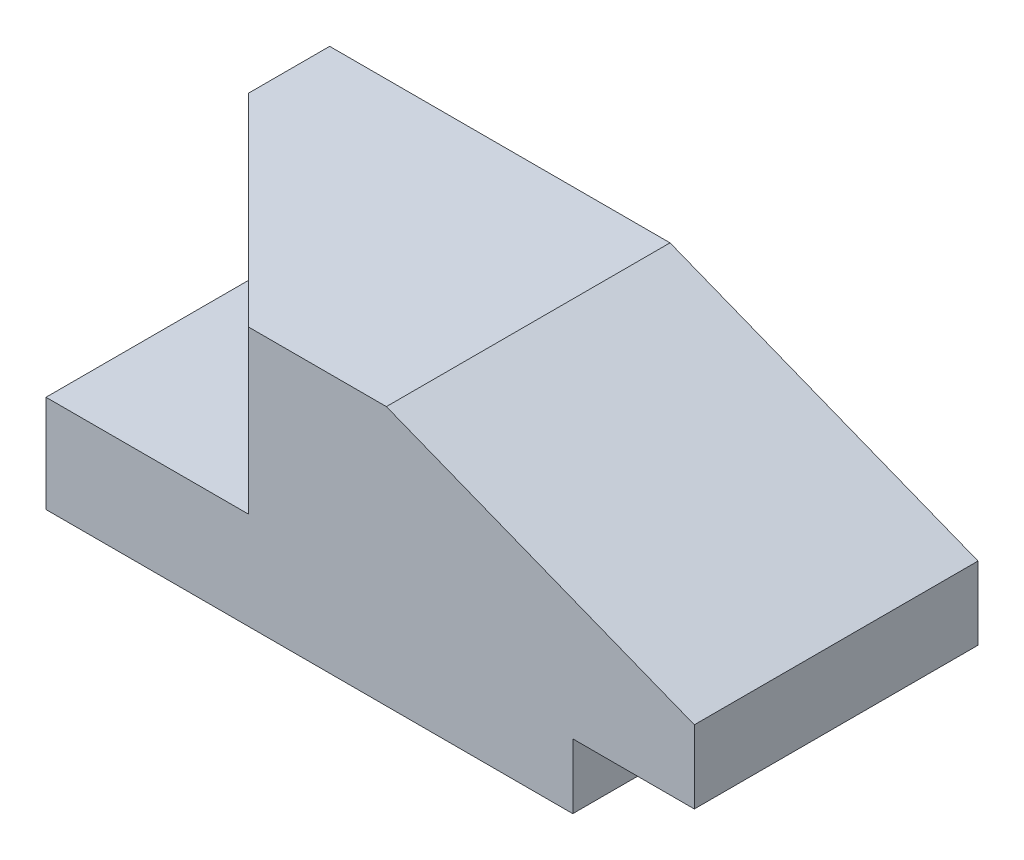
ISO-10303-21;
HEADER;
FILE_DESCRIPTION(('STEP AP214'),'2;1');
FILE_NAME('part.step','',(''),(''),'','','');
FILE_SCHEMA(('AUTOMOTIVE_DESIGN { 1 0 10303 214 1 1 1 1 }'));
ENDSEC;
DATA;
#1=APPLICATION_CONTEXT('core data for automotive mechanical design processes');
#2=APPLICATION_PROTOCOL_DEFINITION('international standard','automotive_design',2000,#1);
#3=PRODUCT_CONTEXT('',#1,'mechanical');
#4=PRODUCT('Part','Part','',(#3));
#5=PRODUCT_RELATED_PRODUCT_CATEGORY('part','',(#4));
#6=PRODUCT_DEFINITION_FORMATION('','',#4);
#7=PRODUCT_DEFINITION_CONTEXT('part definition',#1,'design');
#8=PRODUCT_DEFINITION('design','',#6,#7);
#9=PRODUCT_DEFINITION_SHAPE('','',#8);
#10=(LENGTH_UNIT() NAMED_UNIT(*) SI_UNIT(.MILLI.,.METRE.));
#11=(NAMED_UNIT(*) PLANE_ANGLE_UNIT() SI_UNIT($,.RADIAN.));
#12=(NAMED_UNIT(*) SI_UNIT($,.STERADIAN.) SOLID_ANGLE_UNIT());
#13=UNCERTAINTY_MEASURE_WITH_UNIT(LENGTH_MEASURE(1.E-05),#10,'distance_accuracy_value','');
#14=(GEOMETRIC_REPRESENTATION_CONTEXT(3) GLOBAL_UNCERTAINTY_ASSIGNED_CONTEXT((#13)) GLOBAL_UNIT_ASSIGNED_CONTEXT((#10,
#11,#12)) REPRESENTATION_CONTEXT('',''));
#15=CARTESIAN_POINT('',(0.,0.,0.));
#16=DIRECTION('',(0.,0.,1.));
#17=DIRECTION('',(1.,0.,0.));
#18=AXIS2_PLACEMENT_3D('',#15,#16,#17);
#19=CARTESIAN_POINT('',(15.,0.,-35.));
#20=DIRECTION('',(0.,-1.,0.));
#21=DIRECTION('',(1.,0.,0.));
#22=AXIS2_PLACEMENT_3D('',#19,#20,#21);
#23=PLANE('',#22);
#24=DIRECTION('',(1.,0.,0.));
#25=VECTOR('',#24,1.);
#26=CARTESIAN_POINT('',(15.,0.,0.));
#27=LINE('',#26,#25);
#28=CARTESIAN_POINT('',(0.,0.,0.));
#29=VERTEX_POINT('',#28);
#30=CARTESIAN_POINT('',(15.,0.,0.));
#31=VERTEX_POINT('',#30);
#32=EDGE_CURVE('E149',#29,#31,#27,.T.);
#33=ORIENTED_EDGE('',*,*,#32,.F.);
#34=DIRECTION('',(0.,0.,1.));
#35=VECTOR('',#34,1.);
#36=CARTESIAN_POINT('',(0.,0.,-35.));
#37=LINE('',#36,#35);
#38=CARTESIAN_POINT('',(0.,0.,-35.));
#39=VERTEX_POINT('',#38);
#40=EDGE_CURVE('E11',#39,#29,#37,.T.);
#41=ORIENTED_EDGE('',*,*,#40,.F.);
#42=DIRECTION('',(1.,0.,0.));
#43=VECTOR('',#42,1.);
#44=CARTESIAN_POINT('',(15.,0.,-35.));
#45=LINE('',#44,#43);
#46=CARTESIAN_POINT('',(15.,0.,-35.));
#47=VERTEX_POINT('',#46);
#48=EDGE_CURVE('E174',#39,#47,#45,.T.);
#49=ORIENTED_EDGE('',*,*,#48,.T.);
#50=DIRECTION('',(0.,0.,1.));
#51=VECTOR('',#50,1.);
#52=CARTESIAN_POINT('',(15.,0.,-35.));
#53=LINE('',#52,#51);
#54=EDGE_CURVE('E46',#47,#31,#53,.T.);
#55=ORIENTED_EDGE('',*,*,#54,.T.);
#56=EDGE_LOOP('',(#33,#41,#49,#55));
#57=FACE_BOUND('',#56,.T.);
#58=ADVANCED_FACE('F43',(#57),#23,.T.);
#59=CARTESIAN_POINT('',(0.,0.,-35.));
#60=DIRECTION('',(1.,0.,0.));
#61=DIRECTION('',(0.,1.,0.));
#62=AXIS2_PLACEMENT_3D('',#59,#60,#61);
#63=PLANE('',#62);
#64=DIRECTION('',(0.,1.,0.));
#65=VECTOR('',#64,1.);
#66=CARTESIAN_POINT('',(0.,0.,0.));
#67=LINE('',#66,#65);
#68=CARTESIAN_POINT('',(0.,-8.,0.));
#69=VERTEX_POINT('',#68);
#70=EDGE_CURVE('E171',#69,#29,#67,.T.);
#71=ORIENTED_EDGE('',*,*,#70,.F.);
#72=DIRECTION('',(0.,0.,1.));
#73=VECTOR('',#72,1.);
#74=CARTESIAN_POINT('',(0.,-8.,-35.));
#75=LINE('',#74,#73);
#76=CARTESIAN_POINT('',(0.,-8.,-35.));
#77=VERTEX_POINT('',#76);
#78=EDGE_CURVE('E52',#77,#69,#75,.T.);
#79=ORIENTED_EDGE('',*,*,#78,.F.);
#80=DIRECTION('',(0.,1.,0.));
#81=VECTOR('',#80,1.);
#82=CARTESIAN_POINT('',(0.,0.,-35.));
#83=LINE('',#82,#81);
#84=EDGE_CURVE('E142',#77,#39,#83,.T.);
#85=ORIENTED_EDGE('',*,*,#84,.T.);
#86=ORIENTED_EDGE('',*,*,#40,.T.);
#87=EDGE_LOOP('',(#71,#79,#85,#86));
#88=FACE_BOUND('',#87,.T.);
#89=ADVANCED_FACE('F191',(#88),#63,.T.);
#90=CARTESIAN_POINT('',(0.,-8.,-35.));
#91=DIRECTION('',(0.,-1.,0.));
#92=DIRECTION('',(1.,0.,0.));
#93=AXIS2_PLACEMENT_3D('',#90,#91,#92);
#94=PLANE('',#93);
#95=DIRECTION('',(1.,0.,0.));
#96=VECTOR('',#95,1.);
#97=CARTESIAN_POINT('',(0.,-8.,0.));
#98=LINE('',#97,#96);
#99=CARTESIAN_POINT('',(-65.,-8.00000000000001,0.));
#100=VERTEX_POINT('',#99);
#101=EDGE_CURVE('E138',#100,#69,#98,.T.);
#102=ORIENTED_EDGE('',*,*,#101,.F.);
#103=DIRECTION('',(0.,0.,1.));
#104=VECTOR('',#103,1.);
#105=CARTESIAN_POINT('',(-65.,-8.00000000000001,-35.));
#106=LINE('',#105,#104);
#107=CARTESIAN_POINT('',(-65.,-8.00000000000001,-35.));
#108=VERTEX_POINT('',#107);
#109=EDGE_CURVE('E122',#108,#100,#106,.T.);
#110=ORIENTED_EDGE('',*,*,#109,.F.);
#111=DIRECTION('',(1.,0.,0.));
#112=VECTOR('',#111,1.);
#113=CARTESIAN_POINT('',(0.,-8.,-35.));
#114=LINE('',#113,#112);
#115=EDGE_CURVE('E130',#108,#77,#114,.T.);
#116=ORIENTED_EDGE('',*,*,#115,.T.);
#117=ORIENTED_EDGE('',*,*,#78,.T.);
#118=EDGE_LOOP('',(#102,#110,#116,#117));
#119=FACE_BOUND('',#118,.T.);
#120=ADVANCED_FACE('F135',(#119),#94,.T.);
#121=CARTESIAN_POINT('',(-65.,-8.00000000000001,-35.));
#122=DIRECTION('',(-1.,0.,0.));
#123=DIRECTION('',(0.,0.,1.));
#124=AXIS2_PLACEMENT_3D('',#121,#122,#123);
#125=PLANE('',#124);
#126=DIRECTION('',(0.,1.,0.));
#127=VECTOR('',#126,1.);
#128=CARTESIAN_POINT('',(-65.,3.99999999999999,-25.));
#129=LINE('',#128,#127);
#130=CARTESIAN_POINT('',(-65.,3.99999999999999,-25.));
#131=VERTEX_POINT('',#130);
#132=CARTESIAN_POINT('',(-65.,24.,-25.));
#133=VERTEX_POINT('',#132);
#134=EDGE_CURVE('E154',#131,#133,#129,.T.);
#135=ORIENTED_EDGE('',*,*,#134,.T.);
#136=DIRECTION('',(0.,0.,1.));
#137=VECTOR('',#136,1.);
#138=CARTESIAN_POINT('',(-65.,24.,-35.));
#139=LINE('',#138,#137);
#140=CARTESIAN_POINT('',(-65.,24.,-35.));
#141=VERTEX_POINT('',#140);
#142=EDGE_CURVE('E125',#141,#133,#139,.T.);
#143=ORIENTED_EDGE('',*,*,#142,.F.);
#144=DIRECTION('',(0.,-1.,0.));
#145=VECTOR('',#144,1.);
#146=CARTESIAN_POINT('',(-65.,3.99999999999999,-35.));
#147=LINE('',#146,#145);
#148=EDGE_CURVE('E117',#141,#108,#147,.T.);
#149=ORIENTED_EDGE('',*,*,#148,.T.);
#150=ORIENTED_EDGE('',*,*,#109,.T.);
#151=DIRECTION('',(0.,-1.,0.));
#152=VECTOR('',#151,1.);
#153=CARTESIAN_POINT('',(-65.,-8.00000000000001,0.));
#154=LINE('',#153,#152);
#155=CARTESIAN_POINT('',(-65.,3.99999999999999,0.));
#156=VERTEX_POINT('',#155);
#157=EDGE_CURVE('E166',#156,#100,#154,.T.);
#158=ORIENTED_EDGE('',*,*,#157,.F.);
#159=DIRECTION('',(0.,0.,1.));
#160=VECTOR('',#159,1.);
#161=CARTESIAN_POINT('',(-65.,3.99999999999999,-25.));
#162=LINE('',#161,#160);
#163=EDGE_CURVE('E60',#131,#156,#162,.T.);
#164=ORIENTED_EDGE('',*,*,#163,.F.);
#165=EDGE_LOOP('',(#135,#143,#149,#150,#158,#164));
#166=FACE_BOUND('',#165,.T.);
#167=ADVANCED_FACE('F120',(#166),#125,.T.);
#168=CARTESIAN_POINT('',(-65.,24.,-35.));
#169=DIRECTION('',(0.,1.,0.));
#170=DIRECTION('',(0.,0.,1.));
#171=AXIS2_PLACEMENT_3D('',#168,#169,#170);
#172=PLANE('',#171);
#173=DIRECTION('',(-0.707106781186547,0.,-0.707106781186547));
#174=VECTOR('',#173,1.);
#175=CARTESIAN_POINT('',(-40.,24.,0.));
#176=LINE('',#175,#174);
#177=CARTESIAN_POINT('',(-40.,24.,0.));
#178=VERTEX_POINT('',#177);
#179=EDGE_CURVE('E233',#178,#133,#176,.T.);
#180=ORIENTED_EDGE('',*,*,#179,.F.);
#181=DIRECTION('',(-1.,0.,0.));
#182=VECTOR('',#181,1.);
#183=CARTESIAN_POINT('',(-65.,24.,0.));
#184=LINE('',#183,#182);
#185=CARTESIAN_POINT('',(-23.,24.,0.));
#186=VERTEX_POINT('',#185);
#187=EDGE_CURVE('E162',#186,#178,#184,.T.);
#188=ORIENTED_EDGE('',*,*,#187,.F.);
#189=DIRECTION('',(0.,0.,1.));
#190=VECTOR('',#189,1.);
#191=CARTESIAN_POINT('',(-23.,24.,-35.));
#192=LINE('',#191,#190);
#193=CARTESIAN_POINT('',(-23.,24.,-35.));
#194=VERTEX_POINT('',#193);
#195=EDGE_CURVE('E180',#194,#186,#192,.T.);
#196=ORIENTED_EDGE('',*,*,#195,.F.);
#197=DIRECTION('',(-1.,0.,0.));
#198=VECTOR('',#197,1.);
#199=CARTESIAN_POINT('',(-40.,24.,-35.));
#200=LINE('',#199,#198);
#201=EDGE_CURVE('E131',#194,#141,#200,.T.);
#202=ORIENTED_EDGE('',*,*,#201,.T.);
#203=ORIENTED_EDGE('',*,*,#142,.T.);
#204=EDGE_LOOP('',(#180,#188,#196,#202,#203));
#205=FACE_BOUND('',#204,.T.);
#206=ADVANCED_FACE('F204',(#205),#172,.T.);
#207=CARTESIAN_POINT('',(15.,8.99999999999999,-35.));
#208=DIRECTION('',(0.367166534736048,0.930155221331323,0.));
#209=DIRECTION('',(-0.930155221331323,0.367166534736048,0.));
#210=AXIS2_PLACEMENT_3D('',#207,#208,#209);
#211=PLANE('',#210);
#212=DIRECTION('',(-0.930155221331323,0.367166534736048,0.));
#213=VECTOR('',#212,1.);
#214=CARTESIAN_POINT('',(15.,8.99999999999999,0.));
#215=LINE('',#214,#213);
#216=CARTESIAN_POINT('',(15.,8.99999999999999,0.));
#217=VERTEX_POINT('',#216);
#218=EDGE_CURVE('E158',#217,#186,#215,.T.);
#219=ORIENTED_EDGE('',*,*,#218,.F.);
#220=DIRECTION('',(0.,0.,1.));
#221=VECTOR('',#220,1.);
#222=CARTESIAN_POINT('',(15.,8.99999999999999,-35.));
#223=LINE('',#222,#221);
#224=CARTESIAN_POINT('',(15.,8.99999999999999,-35.));
#225=VERTEX_POINT('',#224);
#226=EDGE_CURVE('E183',#225,#217,#223,.T.);
#227=ORIENTED_EDGE('',*,*,#226,.F.);
#228=DIRECTION('',(-0.930155221331323,0.367166534736048,0.));
#229=VECTOR('',#228,1.);
#230=CARTESIAN_POINT('',(15.,8.99999999999999,-35.));
#231=LINE('',#230,#229);
#232=EDGE_CURVE('E253',#225,#194,#231,.T.);
#233=ORIENTED_EDGE('',*,*,#232,.T.);
#234=ORIENTED_EDGE('',*,*,#195,.T.);
#235=EDGE_LOOP('',(#219,#227,#233,#234));
#236=FACE_BOUND('',#235,.T.);
#237=ADVANCED_FACE('F207',(#236),#211,.T.);
#238=CARTESIAN_POINT('',(15.,8.99999999999999,-35.));
#239=DIRECTION('',(1.,0.,0.));
#240=DIRECTION('',(0.,1.,0.));
#241=AXIS2_PLACEMENT_3D('',#238,#239,#240);
#242=PLANE('',#241);
#243=DIRECTION('',(0.,1.,0.));
#244=VECTOR('',#243,1.);
#245=CARTESIAN_POINT('',(15.,8.99999999999999,0.));
#246=LINE('',#245,#244);
#247=EDGE_CURVE('E153',#31,#217,#246,.T.);
#248=ORIENTED_EDGE('',*,*,#247,.F.);
#249=ORIENTED_EDGE('',*,*,#54,.F.);
#250=DIRECTION('',(0.,1.,0.));
#251=VECTOR('',#250,1.);
#252=CARTESIAN_POINT('',(15.,8.99999999999999,-35.));
#253=LINE('',#252,#251);
#254=EDGE_CURVE('E250',#47,#225,#253,.T.);
#255=ORIENTED_EDGE('',*,*,#254,.T.);
#256=ORIENTED_EDGE('',*,*,#226,.T.);
#257=EDGE_LOOP('',(#248,#249,#255,#256));
#258=FACE_BOUND('',#257,.T.);
#259=ADVANCED_FACE('F187',(#258),#242,.T.);
#260=CARTESIAN_POINT('',(0.,0.,-35.));
#261=DIRECTION('',(0.,0.,1.));
#262=DIRECTION('',(1.,0.,0.));
#263=AXIS2_PLACEMENT_3D('',#260,#261,#262);
#264=PLANE('',#263);
#265=ORIENTED_EDGE('',*,*,#48,.F.);
#266=ORIENTED_EDGE('',*,*,#84,.F.);
#267=ORIENTED_EDGE('',*,*,#115,.F.);
#268=ORIENTED_EDGE('',*,*,#148,.F.);
#269=ORIENTED_EDGE('',*,*,#201,.F.);
#270=ORIENTED_EDGE('',*,*,#232,.F.);
#271=ORIENTED_EDGE('',*,*,#254,.F.);
#272=EDGE_LOOP('',(#265,#266,#267,#268,#269,#270,#271));
#273=FACE_BOUND('',#272,.T.);
#274=ADVANCED_FACE('F141',(#273),#264,.F.);
#275=CARTESIAN_POINT('',(0.,0.,0.));
#276=DIRECTION('',(0.,0.,1.));
#277=DIRECTION('',(1.,0.,0.));
#278=AXIS2_PLACEMENT_3D('',#275,#276,#277);
#279=PLANE('',#278);
#280=DIRECTION('',(0.,1.,0.));
#281=VECTOR('',#280,1.);
#282=CARTESIAN_POINT('',(-40.,3.99999999999999,0.));
#283=LINE('',#282,#281);
#284=CARTESIAN_POINT('',(-40.,3.99999999999999,0.));
#285=VERTEX_POINT('',#284);
#286=EDGE_CURVE('E236',#285,#178,#283,.T.);
#287=ORIENTED_EDGE('',*,*,#286,.F.);
#288=DIRECTION('',(1.,0.,0.));
#289=VECTOR('',#288,1.);
#290=CARTESIAN_POINT('',(-65.,3.99999999999999,0.));
#291=LINE('',#290,#289);
#292=EDGE_CURVE('E228',#156,#285,#291,.T.);
#293=ORIENTED_EDGE('',*,*,#292,.F.);
#294=ORIENTED_EDGE('',*,*,#157,.T.);
#295=ORIENTED_EDGE('',*,*,#101,.T.);
#296=ORIENTED_EDGE('',*,*,#70,.T.);
#297=ORIENTED_EDGE('',*,*,#32,.T.);
#298=ORIENTED_EDGE('',*,*,#247,.T.);
#299=ORIENTED_EDGE('',*,*,#218,.T.);
#300=ORIENTED_EDGE('',*,*,#187,.T.);
#301=EDGE_LOOP('',(#287,#293,#294,#295,#296,#297,#298,#299,#300));
#302=FACE_BOUND('',#301,.T.);
#303=ADVANCED_FACE('F190',(#302),#279,.T.);
#304=CARTESIAN_POINT('',(-40.,3.99999999999999,0.));
#305=DIRECTION('',(0.707106781186548,0.,-0.707106781186548));
#306=DIRECTION('',(-0.707106781186548,0.,-0.707106781186548));
#307=AXIS2_PLACEMENT_3D('',#304,#305,#306);
#308=PLANE('',#307);
#309=ORIENTED_EDGE('',*,*,#179,.T.);
#310=ORIENTED_EDGE('',*,*,#134,.F.);
#311=DIRECTION('',(-0.707106781186547,0.,-0.707106781186547));
#312=VECTOR('',#311,1.);
#313=CARTESIAN_POINT('',(-40.,3.99999999999999,0.));
#314=LINE('',#313,#312);
#315=EDGE_CURVE('E230',#285,#131,#314,.T.);
#316=ORIENTED_EDGE('',*,*,#315,.F.);
#317=ORIENTED_EDGE('',*,*,#286,.T.);
#318=EDGE_LOOP('',(#309,#310,#316,#317));
#319=FACE_BOUND('',#318,.T.);
#320=ADVANCED_FACE('F218',(#319),#308,.F.);
#321=CARTESIAN_POINT('',(0.,3.99999999999999,0.));
#322=DIRECTION('',(0.,-1.,0.));
#323=DIRECTION('',(0.,0.,-1.));
#324=AXIS2_PLACEMENT_3D('',#321,#322,#323);
#325=PLANE('',#324);
#326=ORIENTED_EDGE('',*,*,#292,.T.);
#327=ORIENTED_EDGE('',*,*,#315,.T.);
#328=ORIENTED_EDGE('',*,*,#163,.T.);
#329=EDGE_LOOP('',(#326,#327,#328));
#330=FACE_BOUND('',#329,.T.);
#331=ADVANCED_FACE('F222',(#330),#325,.F.);
#332=CLOSED_SHELL('',(#58,#89,#120,#167,#206,#237,#259,#274,#303,#320,#331));
#333=MANIFOLD_SOLID_BREP('B2',#332);
#334=ADVANCED_BREP_SHAPE_REPRESENTATION('',(#18,#333),#14);
#335=SHAPE_DEFINITION_REPRESENTATION(#9,#334);
ENDSEC;
END-ISO-10303-21;
